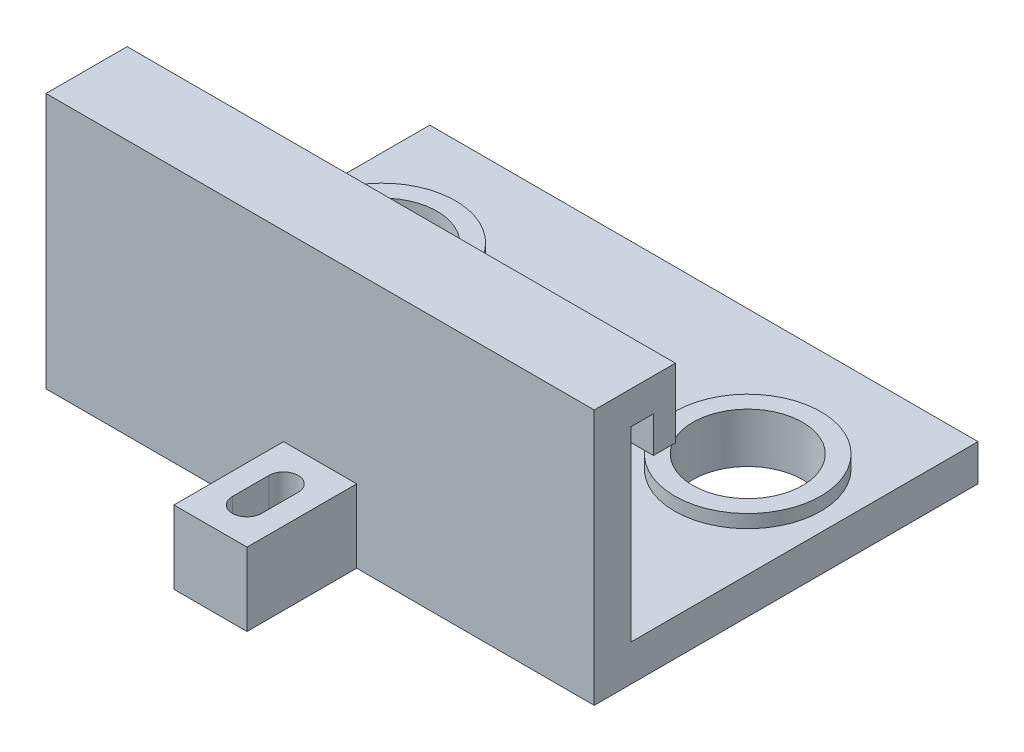
ISO-10303-21;
HEADER;
FILE_DESCRIPTION(('STEP AP214'),'2;1');
FILE_NAME('part.step','',(''),(''),'','','');
FILE_SCHEMA(('AUTOMOTIVE_DESIGN { 1 0 10303 214 1 1 1 1 }'));
ENDSEC;
DATA;
#1=APPLICATION_CONTEXT('core data for automotive mechanical design processes');
#2=APPLICATION_PROTOCOL_DEFINITION('international standard','automotive_design',2000,#1);
#3=PRODUCT_CONTEXT('',#1,'mechanical');
#4=PRODUCT('Part','Part','',(#3));
#5=PRODUCT_RELATED_PRODUCT_CATEGORY('part','',(#4));
#6=PRODUCT_DEFINITION_FORMATION('','',#4);
#7=PRODUCT_DEFINITION_CONTEXT('part definition',#1,'design');
#8=PRODUCT_DEFINITION('design','',#6,#7);
#9=PRODUCT_DEFINITION_SHAPE('','',#8);
#10=(LENGTH_UNIT() NAMED_UNIT(*) SI_UNIT(.MILLI.,.METRE.));
#11=(NAMED_UNIT(*) PLANE_ANGLE_UNIT() SI_UNIT($,.RADIAN.));
#12=(NAMED_UNIT(*) SI_UNIT($,.STERADIAN.) SOLID_ANGLE_UNIT());
#13=UNCERTAINTY_MEASURE_WITH_UNIT(LENGTH_MEASURE(1.E-05),#10,'distance_accuracy_value','');
#14=(GEOMETRIC_REPRESENTATION_CONTEXT(3) GLOBAL_UNCERTAINTY_ASSIGNED_CONTEXT((#13)) GLOBAL_UNIT_ASSIGNED_CONTEXT((#10,
#11,#12)) REPRESENTATION_CONTEXT('',''));
#15=CARTESIAN_POINT('',(0.,0.,0.));
#16=DIRECTION('',(0.,0.,1.));
#17=DIRECTION('',(1.,0.,0.));
#18=AXIS2_PLACEMENT_3D('',#15,#16,#17);
#19=CARTESIAN_POINT('',(0.,0.,0.));
#20=DIRECTION('',(0.,-1.,0.));
#21=DIRECTION('',(0.,0.,-1.));
#22=AXIS2_PLACEMENT_3D('',#19,#20,#21);
#23=PLANE('',#22);
#24=CARTESIAN_POINT('',(0.,0.,36.25));
#25=DIRECTION('',(0.,-1.,0.));
#26=DIRECTION('',(0.,0.,-1.));
#27=AXIS2_PLACEMENT_3D('',#24,#25,#26);
#28=CIRCLE('',#27,2.);
#29=CARTESIAN_POINT('',(2.,0.,36.25));
#30=VERTEX_POINT('',#29);
#31=CARTESIAN_POINT('',(-2.,0.,36.25));
#32=VERTEX_POINT('',#31);
#33=EDGE_CURVE('E170',#30,#32,#28,.T.);
#34=ORIENTED_EDGE('',*,*,#33,.F.);
#35=DIRECTION('',(0.,0.,1.));
#36=VECTOR('',#35,1.);
#37=CARTESIAN_POINT('',(2.,0.,36.25));
#38=LINE('',#37,#36);
#39=CARTESIAN_POINT('',(2.,0.,31.25));
#40=VERTEX_POINT('',#39);
#41=EDGE_CURVE('E188',#40,#30,#38,.T.);
#42=ORIENTED_EDGE('',*,*,#41,.F.);
#43=CARTESIAN_POINT('',(0.,0.,31.25));
#44=DIRECTION('',(0.,-1.,0.));
#45=DIRECTION('',(0.,0.,-1.));
#46=AXIS2_PLACEMENT_3D('',#43,#44,#45);
#47=CIRCLE('',#46,2.);
#48=CARTESIAN_POINT('',(-2.,0.,31.25));
#49=VERTEX_POINT('',#48);
#50=EDGE_CURVE('E191',#49,#40,#47,.T.);
#51=ORIENTED_EDGE('',*,*,#50,.F.);
#52=DIRECTION('',(0.,0.,-1.));
#53=VECTOR('',#52,1.);
#54=CARTESIAN_POINT('',(-2.,0.,36.25));
#55=LINE('',#54,#53);
#56=EDGE_CURVE('E200',#32,#49,#55,.T.);
#57=ORIENTED_EDGE('',*,*,#56,.F.);
#58=EDGE_LOOP('',(#34,#42,#51,#57));
#59=FACE_BOUND('',#58,.T.);
#60=DIRECTION('',(0.,0.,-1.));
#61=VECTOR('',#60,1.);
#62=CARTESIAN_POINT('',(37.5,0.,26.25));
#63=LINE('',#62,#61);
#64=CARTESIAN_POINT('',(37.5,0.,26.25));
#65=VERTEX_POINT('',#64);
#66=CARTESIAN_POINT('',(37.5,0.,-26.25));
#67=VERTEX_POINT('',#66);
#68=EDGE_CURVE('E269',#65,#67,#63,.T.);
#69=ORIENTED_EDGE('',*,*,#68,.F.);
#70=DIRECTION('',(1.,0.,0.));
#71=VECTOR('',#70,1.);
#72=CARTESIAN_POINT('',(-37.5,0.,26.25));
#73=LINE('',#72,#71);
#74=CARTESIAN_POINT('',(5.,0.,26.25));
#75=VERTEX_POINT('',#74);
#76=EDGE_CURVE('E298',#75,#65,#73,.T.);
#77=ORIENTED_EDGE('',*,*,#76,.F.);
#78=DIRECTION('',(0.,0.,1.));
#79=VECTOR('',#78,1.);
#80=CARTESIAN_POINT('',(5.,0.,41.25));
#81=LINE('',#80,#79);
#82=CARTESIAN_POINT('',(5.,0.,41.25));
#83=VERTEX_POINT('',#82);
#84=EDGE_CURVE('E52',#75,#83,#81,.T.);
#85=ORIENTED_EDGE('',*,*,#84,.T.);
#86=DIRECTION('',(-1.,0.,0.));
#87=VECTOR('',#86,1.);
#88=CARTESIAN_POINT('',(-5.,0.,41.25));
#89=LINE('',#88,#87);
#90=CARTESIAN_POINT('',(-5.,0.,41.25));
#91=VERTEX_POINT('',#90);
#92=EDGE_CURVE('E214',#83,#91,#89,.T.);
#93=ORIENTED_EDGE('',*,*,#92,.T.);
#94=DIRECTION('',(0.,0.,-1.));
#95=VECTOR('',#94,1.);
#96=CARTESIAN_POINT('',(-5.,0.,41.25));
#97=LINE('',#96,#95);
#98=CARTESIAN_POINT('',(-5.,0.,26.25));
#99=VERTEX_POINT('',#98);
#100=EDGE_CURVE('E206',#91,#99,#97,.T.);
#101=ORIENTED_EDGE('',*,*,#100,.T.);
#102=CARTESIAN_POINT('',(-37.5,0.,26.25));
#103=VERTEX_POINT('',#102);
#104=EDGE_CURVE('E286',#103,#99,#73,.T.);
#105=ORIENTED_EDGE('',*,*,#104,.F.);
#106=DIRECTION('',(0.,0.,1.));
#107=VECTOR('',#106,1.);
#108=CARTESIAN_POINT('',(-37.5,0.,26.25));
#109=LINE('',#108,#107);
#110=CARTESIAN_POINT('',(-37.5,0.,-26.25));
#111=VERTEX_POINT('',#110);
#112=EDGE_CURVE('E296',#111,#103,#109,.T.);
#113=ORIENTED_EDGE('',*,*,#112,.F.);
#114=DIRECTION('',(-1.,0.,0.));
#115=VECTOR('',#114,1.);
#116=CARTESIAN_POINT('',(-37.5,0.,-26.25));
#117=LINE('',#116,#115);
#118=EDGE_CURVE('E293',#67,#111,#117,.T.);
#119=ORIENTED_EDGE('',*,*,#118,.F.);
#120=EDGE_LOOP('',(#69,#77,#85,#93,#101,#105,#113,#119));
#121=FACE_BOUND('',#120,.T.);
#122=CARTESIAN_POINT('',(-25.,0.,-7.25));
#123=DIRECTION('',(0.,-1.,0.));
#124=DIRECTION('',(0.,0.,-1.));
#125=AXIS2_PLACEMENT_3D('',#122,#123,#124);
#126=CIRCLE('',#125,7.5);
#127=CARTESIAN_POINT('',(-25.,0.,-14.75));
#128=VERTEX_POINT('',#127);
#129=EDGE_CURVE('E310',#128,#128,#126,.T.);
#130=ORIENTED_EDGE('',*,*,#129,.F.);
#131=EDGE_LOOP('',(#130));
#132=FACE_BOUND('',#131,.T.);
#133=CARTESIAN_POINT('',(25.,0.,-7.25));
#134=DIRECTION('',(0.,-1.,0.));
#135=DIRECTION('',(0.,0.,-1.));
#136=AXIS2_PLACEMENT_3D('',#133,#134,#135);
#137=CIRCLE('',#136,7.49999999999999);
#138=CARTESIAN_POINT('',(25.,0.,-14.75));
#139=VERTEX_POINT('',#138);
#140=EDGE_CURVE('E194',#139,#139,#137,.F.);
#141=ORIENTED_EDGE('',*,*,#140,.T.);
#142=EDGE_LOOP('',(#141));
#143=FACE_BOUND('',#142,.T.);
#144=ADVANCED_FACE('F37',(#59,#121,#132,#143),#23,.T.);
#145=CARTESIAN_POINT('',(-37.5,5.,0.));
#146=DIRECTION('',(0.,1.,0.));
#147=DIRECTION('',(0.,0.,1.));
#148=AXIS2_PLACEMENT_3D('',#145,#146,#147);
#149=PLANE('',#148);
#150=CARTESIAN_POINT('',(25.,5.,-7.25));
#151=DIRECTION('',(0.,1.,0.));
#152=DIRECTION('',(0.,0.,1.));
#153=AXIS2_PLACEMENT_3D('',#150,#151,#152);
#154=CIRCLE('',#153,9.99999999999999);
#155=CARTESIAN_POINT('',(25.,5.,2.74999999999999));
#156=VERTEX_POINT('',#155);
#157=EDGE_CURVE('E11',#156,#156,#154,.T.);
#158=ORIENTED_EDGE('',*,*,#157,.F.);
#159=EDGE_LOOP('',(#158));
#160=FACE_BOUND('',#159,.T.);
#161=CARTESIAN_POINT('',(-25.,5.,-7.25));
#162=DIRECTION('',(0.,1.,0.));
#163=DIRECTION('',(0.,0.,1.));
#164=AXIS2_PLACEMENT_3D('',#161,#162,#163);
#165=CIRCLE('',#164,10.);
#166=CARTESIAN_POINT('',(-25.,5.,2.75000000000001));
#167=VERTEX_POINT('',#166);
#168=EDGE_CURVE('E308',#167,#167,#165,.F.);
#169=ORIENTED_EDGE('',*,*,#168,.T.);
#170=EDGE_LOOP('',(#169));
#171=FACE_BOUND('',#170,.T.);
#172=DIRECTION('',(0.,0.,1.));
#173=VECTOR('',#172,1.);
#174=CARTESIAN_POINT('',(37.5,5.,0.));
#175=LINE('',#174,#173);
#176=CARTESIAN_POINT('',(37.5,5.,-26.25));
#177=VERTEX_POINT('',#176);
#178=CARTESIAN_POINT('',(37.5,5.,21.25));
#179=VERTEX_POINT('',#178);
#180=EDGE_CURVE('E239',#177,#179,#175,.T.);
#181=ORIENTED_EDGE('',*,*,#180,.F.);
#182=DIRECTION('',(1.,0.,0.));
#183=VECTOR('',#182,1.);
#184=CARTESIAN_POINT('',(-37.5,5.,-26.25));
#185=LINE('',#184,#183);
#186=CARTESIAN_POINT('',(-37.5,5.,-26.25));
#187=VERTEX_POINT('',#186);
#188=EDGE_CURVE('E270',#187,#177,#185,.T.);
#189=ORIENTED_EDGE('',*,*,#188,.F.);
#190=DIRECTION('',(0.,0.,1.));
#191=VECTOR('',#190,1.);
#192=CARTESIAN_POINT('',(-37.5,5.,0.));
#193=LINE('',#192,#191);
#194=CARTESIAN_POINT('',(-37.5,5.,21.25));
#195=VERTEX_POINT('',#194);
#196=EDGE_CURVE('E248',#187,#195,#193,.T.);
#197=ORIENTED_EDGE('',*,*,#196,.T.);
#198=DIRECTION('',(1.,0.,0.));
#199=VECTOR('',#198,1.);
#200=CARTESIAN_POINT('',(-37.5,5.,21.25));
#201=LINE('',#200,#199);
#202=EDGE_CURVE('E273',#195,#179,#201,.T.);
#203=ORIENTED_EDGE('',*,*,#202,.T.);
#204=EDGE_LOOP('',(#181,#189,#197,#203));
#205=FACE_BOUND('',#204,.T.);
#206=ADVANCED_FACE('F355',(#160,#171,#205),#149,.T.);
#207=CARTESIAN_POINT('',(-37.5,35.,26.25));
#208=DIRECTION('',(0.,0.,-1.));
#209=DIRECTION('',(-1.,0.,0.));
#210=AXIS2_PLACEMENT_3D('',#207,#208,#209);
#211=PLANE('',#210);
#212=DIRECTION('',(0.,-1.,0.));
#213=VECTOR('',#212,1.);
#214=CARTESIAN_POINT('',(-5.,10.,26.25));
#215=LINE('',#214,#213);
#216=CARTESIAN_POINT('',(-5.,10.,26.25));
#217=VERTEX_POINT('',#216);
#218=EDGE_CURVE('E223',#217,#99,#215,.T.);
#219=ORIENTED_EDGE('',*,*,#218,.F.);
#220=DIRECTION('',(1.,0.,0.));
#221=VECTOR('',#220,1.);
#222=CARTESIAN_POINT('',(-5.,10.,26.25));
#223=LINE('',#222,#221);
#224=CARTESIAN_POINT('',(5.,10.,26.25));
#225=VERTEX_POINT('',#224);
#226=EDGE_CURVE('E213',#217,#225,#223,.T.);
#227=ORIENTED_EDGE('',*,*,#226,.T.);
#228=DIRECTION('',(0.,-1.,0.));
#229=VECTOR('',#228,1.);
#230=CARTESIAN_POINT('',(5.,10.,26.25));
#231=LINE('',#230,#229);
#232=EDGE_CURVE('E234',#225,#75,#231,.T.);
#233=ORIENTED_EDGE('',*,*,#232,.T.);
#234=ORIENTED_EDGE('',*,*,#76,.T.);
#235=DIRECTION('',(0.,-1.,0.));
#236=VECTOR('',#235,1.);
#237=CARTESIAN_POINT('',(37.5,35.,26.25));
#238=LINE('',#237,#236);
#239=CARTESIAN_POINT('',(37.5,35.,26.25));
#240=VERTEX_POINT('',#239);
#241=EDGE_CURVE('E290',#240,#65,#238,.T.);
#242=ORIENTED_EDGE('',*,*,#241,.F.);
#243=DIRECTION('',(1.,0.,0.));
#244=VECTOR('',#243,1.);
#245=CARTESIAN_POINT('',(-37.5,35.,26.25));
#246=LINE('',#245,#244);
#247=CARTESIAN_POINT('',(-37.5,35.,26.25));
#248=VERTEX_POINT('',#247);
#249=EDGE_CURVE('E288',#248,#240,#246,.T.);
#250=ORIENTED_EDGE('',*,*,#249,.F.);
#251=DIRECTION('',(0.,-1.,0.));
#252=VECTOR('',#251,1.);
#253=CARTESIAN_POINT('',(-37.5,35.,26.25));
#254=LINE('',#253,#252);
#255=EDGE_CURVE('E303',#248,#103,#254,.T.);
#256=ORIENTED_EDGE('',*,*,#255,.T.);
#257=ORIENTED_EDGE('',*,*,#104,.T.);
#258=EDGE_LOOP('',(#219,#227,#233,#234,#242,#250,#256,#257));
#259=FACE_BOUND('',#258,.T.);
#260=ADVANCED_FACE('F361',(#259),#211,.F.);
#261=CARTESIAN_POINT('',(37.5,35.,26.25));
#262=DIRECTION('',(-1.,0.,0.));
#263=DIRECTION('',(0.,0.,1.));
#264=AXIS2_PLACEMENT_3D('',#261,#262,#263);
#265=PLANE('',#264);
#266=DIRECTION('',(0.,1.,0.));
#267=VECTOR('',#266,1.);
#268=CARTESIAN_POINT('',(37.5,0.,15.15));
#269=LINE('',#268,#267);
#270=CARTESIAN_POINT('',(37.5,25.5485969652881,15.15));
#271=VERTEX_POINT('',#270);
#272=CARTESIAN_POINT('',(37.5,35.,15.15));
#273=VERTEX_POINT('',#272);
#274=EDGE_CURVE('E231',#271,#273,#269,.T.);
#275=ORIENTED_EDGE('',*,*,#274,.T.);
#276=DIRECTION('',(0.,0.,-1.));
#277=VECTOR('',#276,1.);
#278=CARTESIAN_POINT('',(37.5,35.,26.25));
#279=LINE('',#278,#277);
#280=EDGE_CURVE('E282',#240,#273,#279,.T.);
#281=ORIENTED_EDGE('',*,*,#280,.F.);
#282=ORIENTED_EDGE('',*,*,#241,.T.);
#283=ORIENTED_EDGE('',*,*,#68,.T.);
#284=DIRECTION('',(0.,-1.,0.));
#285=VECTOR('',#284,1.);
#286=CARTESIAN_POINT('',(37.5,35.,-26.25));
#287=LINE('',#286,#285);
#288=EDGE_CURVE('E45',#177,#67,#287,.T.);
#289=ORIENTED_EDGE('',*,*,#288,.F.);
#290=ORIENTED_EDGE('',*,*,#180,.T.);
#291=DIRECTION('',(0.,1.,0.));
#292=VECTOR('',#291,1.);
#293=CARTESIAN_POINT('',(37.5,0.,21.25));
#294=LINE('',#293,#292);
#295=CARTESIAN_POINT('',(37.5,30.5,21.25));
#296=VERTEX_POINT('',#295);
#297=EDGE_CURVE('E262',#179,#296,#294,.T.);
#298=ORIENTED_EDGE('',*,*,#297,.T.);
#299=DIRECTION('',(0.,0.,1.));
#300=VECTOR('',#299,1.);
#301=CARTESIAN_POINT('',(37.5,30.5,0.));
#302=LINE('',#301,#300);
#303=CARTESIAN_POINT('',(37.5,30.5,18.15));
#304=VERTEX_POINT('',#303);
#305=EDGE_CURVE('E259',#304,#296,#302,.T.);
#306=ORIENTED_EDGE('',*,*,#305,.F.);
#307=DIRECTION('',(0.,-1.,0.));
#308=VECTOR('',#307,1.);
#309=CARTESIAN_POINT('',(37.5,0.,18.15));
#310=LINE('',#309,#308);
#311=CARTESIAN_POINT('',(37.5,25.5485969652881,18.15));
#312=VERTEX_POINT('',#311);
#313=EDGE_CURVE('E256',#304,#312,#310,.T.);
#314=ORIENTED_EDGE('',*,*,#313,.T.);
#315=DIRECTION('',(0.,0.,-1.));
#316=VECTOR('',#315,1.);
#317=CARTESIAN_POINT('',(37.5,25.5485969652881,0.));
#318=LINE('',#317,#316);
#319=EDGE_CURVE('E253',#312,#271,#318,.T.);
#320=ORIENTED_EDGE('',*,*,#319,.T.);
#321=EDGE_LOOP('',(#275,#281,#282,#283,#289,#290,#298,#306,#314,#320));
#322=FACE_BOUND('',#321,.T.);
#323=ADVANCED_FACE('F39',(#322),#265,.F.);
#324=CARTESIAN_POINT('',(-37.5,35.,-26.25));
#325=DIRECTION('',(0.,0.,1.));
#326=DIRECTION('',(1.,0.,0.));
#327=AXIS2_PLACEMENT_3D('',#324,#325,#326);
#328=PLANE('',#327);
#329=ORIENTED_EDGE('',*,*,#188,.T.);
#330=ORIENTED_EDGE('',*,*,#288,.T.);
#331=ORIENTED_EDGE('',*,*,#118,.T.);
#332=DIRECTION('',(0.,-1.,0.));
#333=VECTOR('',#332,1.);
#334=CARTESIAN_POINT('',(-37.5,35.,-26.25));
#335=LINE('',#334,#333);
#336=EDGE_CURVE('E306',#187,#111,#335,.T.);
#337=ORIENTED_EDGE('',*,*,#336,.F.);
#338=EDGE_LOOP('',(#329,#330,#331,#337));
#339=FACE_BOUND('',#338,.T.);
#340=ADVANCED_FACE('F374',(#339),#328,.F.);
#341=CARTESIAN_POINT('',(-37.5,35.,26.25));
#342=DIRECTION('',(1.,0.,0.));
#343=DIRECTION('',(0.,0.,-1.));
#344=AXIS2_PLACEMENT_3D('',#341,#342,#343);
#345=PLANE('',#344);
#346=DIRECTION('',(0.,1.,0.));
#347=VECTOR('',#346,1.);
#348=CARTESIAN_POINT('',(-37.5,0.,15.15));
#349=LINE('',#348,#347);
#350=CARTESIAN_POINT('',(-37.5,25.5485969652881,15.15));
#351=VERTEX_POINT('',#350);
#352=CARTESIAN_POINT('',(-37.5,35.,15.15));
#353=VERTEX_POINT('',#352);
#354=EDGE_CURVE('E60',#351,#353,#349,.T.);
#355=ORIENTED_EDGE('',*,*,#354,.F.);
#356=DIRECTION('',(0.,0.,-1.));
#357=VECTOR('',#356,1.);
#358=CARTESIAN_POINT('',(-37.5,25.5485969652881,0.));
#359=LINE('',#358,#357);
#360=CARTESIAN_POINT('',(-37.5,25.5485969652881,18.15));
#361=VERTEX_POINT('',#360);
#362=EDGE_CURVE('E238',#361,#351,#359,.T.);
#363=ORIENTED_EDGE('',*,*,#362,.F.);
#364=DIRECTION('',(0.,-1.,0.));
#365=VECTOR('',#364,1.);
#366=CARTESIAN_POINT('',(-37.5,0.,18.15));
#367=LINE('',#366,#365);
#368=CARTESIAN_POINT('',(-37.5,30.5,18.15));
#369=VERTEX_POINT('',#368);
#370=EDGE_CURVE('E241',#369,#361,#367,.T.);
#371=ORIENTED_EDGE('',*,*,#370,.F.);
#372=DIRECTION('',(0.,0.,1.));
#373=VECTOR('',#372,1.);
#374=CARTESIAN_POINT('',(-37.5,30.5,0.));
#375=LINE('',#374,#373);
#376=CARTESIAN_POINT('',(-37.5,30.5,21.25));
#377=VERTEX_POINT('',#376);
#378=EDGE_CURVE('E243',#369,#377,#375,.T.);
#379=ORIENTED_EDGE('',*,*,#378,.T.);
#380=DIRECTION('',(0.,1.,0.));
#381=VECTOR('',#380,1.);
#382=CARTESIAN_POINT('',(-37.5,0.,21.25));
#383=LINE('',#382,#381);
#384=EDGE_CURVE('E246',#195,#377,#383,.T.);
#385=ORIENTED_EDGE('',*,*,#384,.F.);
#386=ORIENTED_EDGE('',*,*,#196,.F.);
#387=ORIENTED_EDGE('',*,*,#336,.T.);
#388=ORIENTED_EDGE('',*,*,#112,.T.);
#389=ORIENTED_EDGE('',*,*,#255,.F.);
#390=DIRECTION('',(0.,0.,1.));
#391=VECTOR('',#390,1.);
#392=CARTESIAN_POINT('',(-37.5,35.,26.25));
#393=LINE('',#392,#391);
#394=EDGE_CURVE('E285',#353,#248,#393,.T.);
#395=ORIENTED_EDGE('',*,*,#394,.F.);
#396=EDGE_LOOP('',(#355,#363,#371,#379,#385,#386,#387,#388,#389,#395));
#397=FACE_BOUND('',#396,.T.);
#398=ADVANCED_FACE('F372',(#397),#345,.F.);
#399=CARTESIAN_POINT('',(0.,35.,0.));
#400=DIRECTION('',(0.,-1.,0.));
#401=DIRECTION('',(0.,0.,-1.));
#402=AXIS2_PLACEMENT_3D('',#399,#400,#401);
#403=PLANE('',#402);
#404=DIRECTION('',(1.,0.,0.));
#405=VECTOR('',#404,1.);
#406=CARTESIAN_POINT('',(-37.5,35.,15.15));
#407=LINE('',#406,#405);
#408=EDGE_CURVE('E267',#353,#273,#407,.T.);
#409=ORIENTED_EDGE('',*,*,#408,.F.);
#410=ORIENTED_EDGE('',*,*,#394,.T.);
#411=ORIENTED_EDGE('',*,*,#249,.T.);
#412=ORIENTED_EDGE('',*,*,#280,.T.);
#413=EDGE_LOOP('',(#409,#410,#411,#412));
#414=FACE_BOUND('',#413,.T.);
#415=ADVANCED_FACE('F367',(#414),#403,.F.);
#416=CARTESIAN_POINT('',(-37.5,0.,15.15));
#417=DIRECTION('',(0.,0.,-1.));
#418=DIRECTION('',(-1.,0.,0.));
#419=AXIS2_PLACEMENT_3D('',#416,#417,#418);
#420=PLANE('',#419);
#421=ORIENTED_EDGE('',*,*,#274,.F.);
#422=DIRECTION('',(1.,0.,0.));
#423=VECTOR('',#422,1.);
#424=CARTESIAN_POINT('',(-37.5,25.5485969652881,15.15));
#425=LINE('',#424,#423);
#426=EDGE_CURVE('E250',#351,#271,#425,.T.);
#427=ORIENTED_EDGE('',*,*,#426,.F.);
#428=ORIENTED_EDGE('',*,*,#354,.T.);
#429=ORIENTED_EDGE('',*,*,#408,.T.);
#430=EDGE_LOOP('',(#421,#427,#428,#429));
#431=FACE_BOUND('',#430,.T.);
#432=ADVANCED_FACE('F406',(#431),#420,.T.);
#433=CARTESIAN_POINT('',(-37.5,0.,21.25));
#434=DIRECTION('',(0.,0.,-1.));
#435=DIRECTION('',(-1.,0.,0.));
#436=AXIS2_PLACEMENT_3D('',#433,#434,#435);
#437=PLANE('',#436);
#438=ORIENTED_EDGE('',*,*,#297,.F.);
#439=ORIENTED_EDGE('',*,*,#202,.F.);
#440=ORIENTED_EDGE('',*,*,#384,.T.);
#441=DIRECTION('',(1.,0.,0.));
#442=VECTOR('',#441,1.);
#443=CARTESIAN_POINT('',(-37.5,30.5,21.25));
#444=LINE('',#443,#442);
#445=EDGE_CURVE('E275',#377,#296,#444,.T.);
#446=ORIENTED_EDGE('',*,*,#445,.T.);
#447=EDGE_LOOP('',(#438,#439,#440,#446));
#448=FACE_BOUND('',#447,.T.);
#449=ADVANCED_FACE('F419',(#448),#437,.T.);
#450=CARTESIAN_POINT('',(-37.5,30.5,0.));
#451=DIRECTION('',(0.,1.,0.));
#452=DIRECTION('',(0.,0.,1.));
#453=AXIS2_PLACEMENT_3D('',#450,#451,#452);
#454=PLANE('',#453);
#455=ORIENTED_EDGE('',*,*,#305,.T.);
#456=ORIENTED_EDGE('',*,*,#445,.F.);
#457=ORIENTED_EDGE('',*,*,#378,.F.);
#458=DIRECTION('',(1.,0.,0.));
#459=VECTOR('',#458,1.);
#460=CARTESIAN_POINT('',(-37.5,30.5,18.15));
#461=LINE('',#460,#459);
#462=EDGE_CURVE('E277',#369,#304,#461,.T.);
#463=ORIENTED_EDGE('',*,*,#462,.T.);
#464=EDGE_LOOP('',(#455,#456,#457,#463));
#465=FACE_BOUND('',#464,.T.);
#466=ADVANCED_FACE('F414',(#465),#454,.F.);
#467=CARTESIAN_POINT('',(-37.5,0.,18.15));
#468=DIRECTION('',(0.,0.,1.));
#469=DIRECTION('',(0.,-1.,0.));
#470=AXIS2_PLACEMENT_3D('',#467,#468,#469);
#471=PLANE('',#470);
#472=ORIENTED_EDGE('',*,*,#313,.F.);
#473=ORIENTED_EDGE('',*,*,#462,.F.);
#474=ORIENTED_EDGE('',*,*,#370,.T.);
#475=DIRECTION('',(1.,0.,0.));
#476=VECTOR('',#475,1.);
#477=CARTESIAN_POINT('',(-37.5,25.5485969652881,18.15));
#478=LINE('',#477,#476);
#479=EDGE_CURVE('E279',#361,#312,#478,.T.);
#480=ORIENTED_EDGE('',*,*,#479,.T.);
#481=EDGE_LOOP('',(#472,#473,#474,#480));
#482=FACE_BOUND('',#481,.T.);
#483=ADVANCED_FACE('F410',(#482),#471,.T.);
#484=CARTESIAN_POINT('',(-37.5,25.5485969652881,0.));
#485=DIRECTION('',(0.,-1.,0.));
#486=DIRECTION('',(0.,0.,-1.));
#487=AXIS2_PLACEMENT_3D('',#484,#485,#486);
#488=PLANE('',#487);
#489=ORIENTED_EDGE('',*,*,#319,.F.);
#490=ORIENTED_EDGE('',*,*,#479,.F.);
#491=ORIENTED_EDGE('',*,*,#362,.T.);
#492=ORIENTED_EDGE('',*,*,#426,.T.);
#493=EDGE_LOOP('',(#489,#490,#491,#492));
#494=FACE_BOUND('',#493,.T.);
#495=ADVANCED_FACE('F404',(#494),#488,.T.);
#496=CARTESIAN_POINT('',(-5.,10.,41.25));
#497=DIRECTION('',(-1.,0.,0.));
#498=DIRECTION('',(0.,0.,1.));
#499=AXIS2_PLACEMENT_3D('',#496,#497,#498);
#500=PLANE('',#499);
#501=ORIENTED_EDGE('',*,*,#100,.F.);
#502=DIRECTION('',(0.,-1.,0.));
#503=VECTOR('',#502,1.);
#504=CARTESIAN_POINT('',(-5.,10.,41.25));
#505=LINE('',#504,#503);
#506=CARTESIAN_POINT('',(-5.,10.,41.25));
#507=VERTEX_POINT('',#506);
#508=EDGE_CURVE('E229',#507,#91,#505,.T.);
#509=ORIENTED_EDGE('',*,*,#508,.F.);
#510=DIRECTION('',(0.,0.,-1.));
#511=VECTOR('',#510,1.);
#512=CARTESIAN_POINT('',(-5.,10.,41.25));
#513=LINE('',#512,#511);
#514=EDGE_CURVE('E210',#507,#217,#513,.T.);
#515=ORIENTED_EDGE('',*,*,#514,.T.);
#516=ORIENTED_EDGE('',*,*,#218,.T.);
#517=EDGE_LOOP('',(#501,#509,#515,#516));
#518=FACE_BOUND('',#517,.T.);
#519=ADVANCED_FACE('F432',(#518),#500,.T.);
#520=CARTESIAN_POINT('',(-5.,10.,41.25));
#521=DIRECTION('',(0.,0.,1.));
#522=DIRECTION('',(1.,0.,0.));
#523=AXIS2_PLACEMENT_3D('',#520,#521,#522);
#524=PLANE('',#523);
#525=ORIENTED_EDGE('',*,*,#92,.F.);
#526=DIRECTION('',(0.,-1.,0.));
#527=VECTOR('',#526,1.);
#528=CARTESIAN_POINT('',(5.,10.,41.25));
#529=LINE('',#528,#527);
#530=CARTESIAN_POINT('',(5.,10.,41.25));
#531=VERTEX_POINT('',#530);
#532=EDGE_CURVE('E232',#531,#83,#529,.T.);
#533=ORIENTED_EDGE('',*,*,#532,.F.);
#534=DIRECTION('',(-1.,0.,0.));
#535=VECTOR('',#534,1.);
#536=CARTESIAN_POINT('',(-5.,10.,41.25));
#537=LINE('',#536,#535);
#538=EDGE_CURVE('E220',#531,#507,#537,.T.);
#539=ORIENTED_EDGE('',*,*,#538,.T.);
#540=ORIENTED_EDGE('',*,*,#508,.T.);
#541=EDGE_LOOP('',(#525,#533,#539,#540));
#542=FACE_BOUND('',#541,.T.);
#543=ADVANCED_FACE('F436',(#542),#524,.T.);
#544=CARTESIAN_POINT('',(5.,10.,41.25));
#545=DIRECTION('',(1.,0.,0.));
#546=DIRECTION('',(0.,0.,-1.));
#547=AXIS2_PLACEMENT_3D('',#544,#545,#546);
#548=PLANE('',#547);
#549=ORIENTED_EDGE('',*,*,#84,.F.);
#550=ORIENTED_EDGE('',*,*,#232,.F.);
#551=DIRECTION('',(0.,0.,1.));
#552=VECTOR('',#551,1.);
#553=CARTESIAN_POINT('',(5.,10.,41.25));
#554=LINE('',#553,#552);
#555=EDGE_CURVE('E217',#225,#531,#554,.T.);
#556=ORIENTED_EDGE('',*,*,#555,.T.);
#557=ORIENTED_EDGE('',*,*,#532,.T.);
#558=EDGE_LOOP('',(#549,#550,#556,#557));
#559=FACE_BOUND('',#558,.T.);
#560=ADVANCED_FACE('F441',(#559),#548,.T.);
#561=CARTESIAN_POINT('',(0.,10.,0.));
#562=DIRECTION('',(0.,-1.,0.));
#563=DIRECTION('',(0.,0.,-1.));
#564=AXIS2_PLACEMENT_3D('',#561,#562,#563);
#565=PLANE('',#564);
#566=DIRECTION('',(0.,0.,1.));
#567=VECTOR('',#566,1.);
#568=CARTESIAN_POINT('',(2.,10.,36.25));
#569=LINE('',#568,#567);
#570=CARTESIAN_POINT('',(2.,10.,31.25));
#571=VERTEX_POINT('',#570);
#572=CARTESIAN_POINT('',(2.,10.,36.25));
#573=VERTEX_POINT('',#572);
#574=EDGE_CURVE('E175',#571,#573,#569,.T.);
#575=ORIENTED_EDGE('',*,*,#574,.T.);
#576=CARTESIAN_POINT('',(0.,10.,36.25));
#577=DIRECTION('',(0.,-1.,0.));
#578=DIRECTION('',(0.,0.,-1.));
#579=AXIS2_PLACEMENT_3D('',#576,#577,#578);
#580=CIRCLE('',#579,2.);
#581=CARTESIAN_POINT('',(-2.,10.,36.25));
#582=VERTEX_POINT('',#581);
#583=EDGE_CURVE('E167',#573,#582,#580,.T.);
#584=ORIENTED_EDGE('',*,*,#583,.T.);
#585=DIRECTION('',(0.,0.,-1.));
#586=VECTOR('',#585,1.);
#587=CARTESIAN_POINT('',(-2.,10.,36.25));
#588=LINE('',#587,#586);
#589=CARTESIAN_POINT('',(-2.,10.,31.25));
#590=VERTEX_POINT('',#589);
#591=EDGE_CURVE('E179',#582,#590,#588,.T.);
#592=ORIENTED_EDGE('',*,*,#591,.T.);
#593=CARTESIAN_POINT('',(0.,10.,31.25));
#594=DIRECTION('',(0.,-1.,0.));
#595=DIRECTION('',(0.,0.,-1.));
#596=AXIS2_PLACEMENT_3D('',#593,#594,#595);
#597=CIRCLE('',#596,2.);
#598=EDGE_CURVE('E183',#590,#571,#597,.T.);
#599=ORIENTED_EDGE('',*,*,#598,.T.);
#600=EDGE_LOOP('',(#575,#584,#592,#599));
#601=FACE_BOUND('',#600,.T.);
#602=ORIENTED_EDGE('',*,*,#514,.F.);
#603=ORIENTED_EDGE('',*,*,#538,.F.);
#604=ORIENTED_EDGE('',*,*,#555,.F.);
#605=ORIENTED_EDGE('',*,*,#226,.F.);
#606=EDGE_LOOP('',(#602,#603,#604,#605));
#607=FACE_BOUND('',#606,.T.);
#608=ADVANCED_FACE('F185',(#601,#607),#565,.F.);
#609=CARTESIAN_POINT('',(0.,10.,36.25));
#610=DIRECTION('',(0.,-1.,0.));
#611=DIRECTION('',(0.,0.,-1.));
#612=AXIS2_PLACEMENT_3D('',#609,#610,#611);
#613=CYLINDRICAL_SURFACE('',#612,2.);
#614=ORIENTED_EDGE('',*,*,#33,.T.);
#615=DIRECTION('',(0.,-1.,0.));
#616=VECTOR('',#615,1.);
#617=CARTESIAN_POINT('',(-2.,10.,36.25));
#618=LINE('',#617,#616);
#619=EDGE_CURVE('E163',#582,#32,#618,.T.);
#620=ORIENTED_EDGE('',*,*,#619,.F.);
#621=ORIENTED_EDGE('',*,*,#583,.F.);
#622=DIRECTION('',(0.,-1.,0.));
#623=VECTOR('',#622,1.);
#624=CARTESIAN_POINT('',(2.,10.,36.25));
#625=LINE('',#624,#623);
#626=EDGE_CURVE('E204',#573,#30,#625,.T.);
#627=ORIENTED_EDGE('',*,*,#626,.T.);
#628=EDGE_LOOP('',(#614,#620,#621,#627));
#629=FACE_BOUND('',#628,.T.);
#630=ADVANCED_FACE('F165',(#629),#613,.F.);
#631=CARTESIAN_POINT('',(2.,10.,36.25));
#632=DIRECTION('',(1.,0.,0.));
#633=DIRECTION('',(0.,0.,-1.));
#634=AXIS2_PLACEMENT_3D('',#631,#632,#633);
#635=PLANE('',#634);
#636=ORIENTED_EDGE('',*,*,#41,.T.);
#637=ORIENTED_EDGE('',*,*,#626,.F.);
#638=ORIENTED_EDGE('',*,*,#574,.F.);
#639=DIRECTION('',(0.,-1.,0.));
#640=VECTOR('',#639,1.);
#641=CARTESIAN_POINT('',(2.,10.,31.25));
#642=LINE('',#641,#640);
#643=EDGE_CURVE('E207',#571,#40,#642,.T.);
#644=ORIENTED_EDGE('',*,*,#643,.T.);
#645=EDGE_LOOP('',(#636,#637,#638,#644));
#646=FACE_BOUND('',#645,.T.);
#647=ADVANCED_FACE('F452',(#646),#635,.F.);
#648=CARTESIAN_POINT('',(0.,10.,31.25));
#649=DIRECTION('',(0.,-1.,0.));
#650=DIRECTION('',(0.,0.,-1.));
#651=AXIS2_PLACEMENT_3D('',#648,#649,#650);
#652=CYLINDRICAL_SURFACE('',#651,2.);
#653=ORIENTED_EDGE('',*,*,#50,.T.);
#654=ORIENTED_EDGE('',*,*,#643,.F.);
#655=ORIENTED_EDGE('',*,*,#598,.F.);
#656=DIRECTION('',(0.,-1.,0.));
#657=VECTOR('',#656,1.);
#658=CARTESIAN_POINT('',(-2.,10.,31.25));
#659=LINE('',#658,#657);
#660=EDGE_CURVE('E174',#590,#49,#659,.T.);
#661=ORIENTED_EDGE('',*,*,#660,.T.);
#662=EDGE_LOOP('',(#653,#654,#655,#661));
#663=FACE_BOUND('',#662,.T.);
#664=ADVANCED_FACE('F455',(#663),#652,.F.);
#665=CARTESIAN_POINT('',(-2.,10.,36.25));
#666=DIRECTION('',(-1.,0.,0.));
#667=DIRECTION('',(0.,0.,1.));
#668=AXIS2_PLACEMENT_3D('',#665,#666,#667);
#669=PLANE('',#668);
#670=ORIENTED_EDGE('',*,*,#56,.T.);
#671=ORIENTED_EDGE('',*,*,#660,.F.);
#672=ORIENTED_EDGE('',*,*,#591,.F.);
#673=ORIENTED_EDGE('',*,*,#619,.T.);
#674=EDGE_LOOP('',(#670,#671,#672,#673));
#675=FACE_BOUND('',#674,.T.);
#676=ADVANCED_FACE('F180',(#675),#669,.F.);
#677=CARTESIAN_POINT('',(-25.,-8.5,-7.25));
#678=DIRECTION('',(0.,1.,0.));
#679=DIRECTION('',(0.,0.,1.));
#680=AXIS2_PLACEMENT_3D('',#677,#678,#679);
#681=CYLINDRICAL_SURFACE('',#680,7.5);
#682=ORIENTED_EDGE('',*,*,#129,.T.);
#683=EDGE_LOOP('',(#682));
#684=FACE_BOUND('',#683,.T.);
#685=CARTESIAN_POINT('',(-25.,6.8,-7.25));
#686=DIRECTION('',(0.,1.,0.));
#687=DIRECTION('',(0.,0.,1.));
#688=AXIS2_PLACEMENT_3D('',#685,#686,#687);
#689=CIRCLE('',#688,7.5);
#690=CARTESIAN_POINT('',(-25.,6.8,0.250000000000003));
#691=VERTEX_POINT('',#690);
#692=EDGE_CURVE('E316',#691,#691,#689,.T.);
#693=ORIENTED_EDGE('',*,*,#692,.T.);
#694=EDGE_LOOP('',(#693));
#695=FACE_BOUND('',#694,.T.);
#696=ADVANCED_FACE('F341',(#684,#695),#681,.F.);
#697=CARTESIAN_POINT('',(25.,-8.5,-7.25));
#698=DIRECTION('',(0.,1.,0.));
#699=DIRECTION('',(0.,0.,1.));
#700=AXIS2_PLACEMENT_3D('',#697,#698,#699);
#701=CYLINDRICAL_SURFACE('',#700,7.49999999999999);
#702=ORIENTED_EDGE('',*,*,#140,.F.);
#703=EDGE_LOOP('',(#702));
#704=FACE_BOUND('',#703,.T.);
#705=CARTESIAN_POINT('',(25.,6.8,-7.25));
#706=DIRECTION('',(0.,1.,0.));
#707=DIRECTION('',(0.,0.,1.));
#708=AXIS2_PLACEMENT_3D('',#705,#706,#707);
#709=CIRCLE('',#708,7.49999999999999);
#710=CARTESIAN_POINT('',(25.,6.8,0.249999999999989));
#711=VERTEX_POINT('',#710);
#712=EDGE_CURVE('E321',#711,#711,#709,.F.);
#713=ORIENTED_EDGE('',*,*,#712,.F.);
#714=EDGE_LOOP('',(#713));
#715=FACE_BOUND('',#714,.T.);
#716=ADVANCED_FACE('F338',(#704,#715),#701,.F.);
#717=CARTESIAN_POINT('',(-25.,6.8,-7.25));
#718=DIRECTION('',(0.,-1.,0.));
#719=DIRECTION('',(0.,0.,-1.));
#720=AXIS2_PLACEMENT_3D('',#717,#718,#719);
#721=CYLINDRICAL_SURFACE('',#720,10.);
#722=ORIENTED_EDGE('',*,*,#168,.F.);
#723=EDGE_LOOP('',(#722));
#724=FACE_BOUND('',#723,.T.);
#725=CARTESIAN_POINT('',(-25.,6.8,-7.25));
#726=DIRECTION('',(0.,1.,0.));
#727=DIRECTION('',(0.,0.,1.));
#728=AXIS2_PLACEMENT_3D('',#725,#726,#727);
#729=CIRCLE('',#728,10.);
#730=CARTESIAN_POINT('',(-25.,6.8,2.75000000000001));
#731=VERTEX_POINT('',#730);
#732=EDGE_CURVE('E311',#731,#731,#729,.T.);
#733=ORIENTED_EDGE('',*,*,#732,.F.);
#734=EDGE_LOOP('',(#733));
#735=FACE_BOUND('',#734,.T.);
#736=ADVANCED_FACE('F340',(#724,#735),#721,.T.);
#737=CARTESIAN_POINT('',(0.,6.8,0.));
#738=DIRECTION('',(0.,1.,0.));
#739=DIRECTION('',(0.,0.,1.));
#740=AXIS2_PLACEMENT_3D('',#737,#738,#739);
#741=PLANE('',#740);
#742=ORIENTED_EDGE('',*,*,#692,.F.);
#743=EDGE_LOOP('',(#742));
#744=FACE_BOUND('',#743,.T.);
#745=ORIENTED_EDGE('',*,*,#732,.T.);
#746=EDGE_LOOP('',(#745));
#747=FACE_BOUND('',#746,.T.);
#748=ADVANCED_FACE('F348',(#744,#747),#741,.T.);
#749=CARTESIAN_POINT('',(25.,6.8,-7.25));
#750=DIRECTION('',(0.,-1.,0.));
#751=DIRECTION('',(0.,0.,-1.));
#752=AXIS2_PLACEMENT_3D('',#749,#750,#751);
#753=CYLINDRICAL_SURFACE('',#752,9.99999999999999);
#754=ORIENTED_EDGE('',*,*,#157,.T.);
#755=EDGE_LOOP('',(#754));
#756=FACE_BOUND('',#755,.T.);
#757=CARTESIAN_POINT('',(25.,6.8,-7.25));
#758=DIRECTION('',(0.,1.,0.));
#759=DIRECTION('',(0.,0.,1.));
#760=AXIS2_PLACEMENT_3D('',#757,#758,#759);
#761=CIRCLE('',#760,9.99999999999999);
#762=CARTESIAN_POINT('',(25.,6.8,2.74999999999999));
#763=VERTEX_POINT('',#762);
#764=EDGE_CURVE('E326',#763,#763,#761,.F.);
#765=ORIENTED_EDGE('',*,*,#764,.T.);
#766=EDGE_LOOP('',(#765));
#767=FACE_BOUND('',#766,.T.);
#768=ADVANCED_FACE('F330',(#756,#767),#753,.T.);
#769=CARTESIAN_POINT('',(0.,6.8,0.));
#770=DIRECTION('',(0.,1.,0.));
#771=DIRECTION('',(0.,0.,1.));
#772=AXIS2_PLACEMENT_3D('',#769,#770,#771);
#773=PLANE('',#772);
#774=ORIENTED_EDGE('',*,*,#764,.F.);
#775=EDGE_LOOP('',(#774));
#776=FACE_BOUND('',#775,.T.);
#777=ORIENTED_EDGE('',*,*,#712,.T.);
#778=EDGE_LOOP('',(#777));
#779=FACE_BOUND('',#778,.T.);
#780=ADVANCED_FACE('F332',(#776,#779),#773,.T.);
#781=CLOSED_SHELL('',(#144,#206,#260,#323,#340,#398,#415,#432,#449,#466,#483,#495,#519,#543,
#560,#608,#630,#647,#664,#676,#696,#716,#736,#748,#768,#780));
#782=MANIFOLD_SOLID_BREP('B2',#781);
#783=ADVANCED_BREP_SHAPE_REPRESENTATION('',(#18,#782),#14);
#784=SHAPE_DEFINITION_REPRESENTATION(#9,#783);
ENDSEC;
END-ISO-10303-21;
